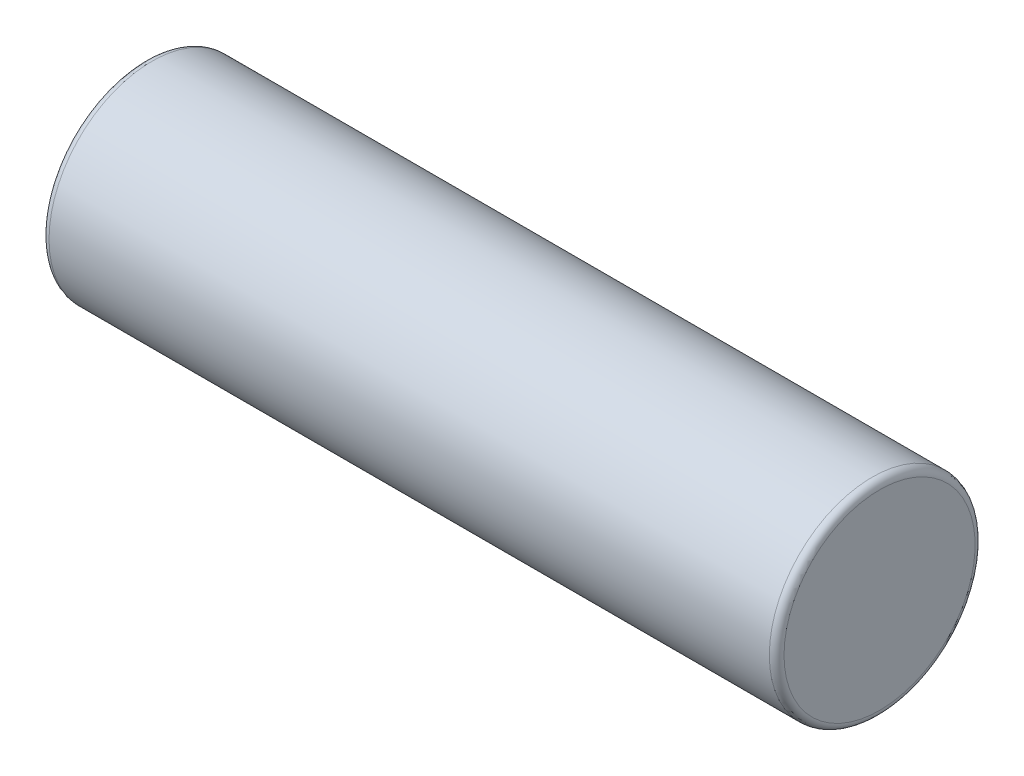
ISO-10303-21;
HEADER;
FILE_DESCRIPTION(('STEP AP214'),'2;1');
FILE_NAME('part.step','',(''),(''),'','','');
FILE_SCHEMA(('AUTOMOTIVE_DESIGN { 1 0 10303 214 1 1 1 1 }'));
ENDSEC;
DATA;
#1=APPLICATION_CONTEXT('core data for automotive mechanical design processes');
#2=APPLICATION_PROTOCOL_DEFINITION('international standard','automotive_design',2000,#1);
#3=PRODUCT_CONTEXT('',#1,'mechanical');
#4=PRODUCT('Part','Part','',(#3));
#5=PRODUCT_RELATED_PRODUCT_CATEGORY('part','',(#4));
#6=PRODUCT_DEFINITION_FORMATION('','',#4);
#7=PRODUCT_DEFINITION_CONTEXT('part definition',#1,'design');
#8=PRODUCT_DEFINITION('design','',#6,#7);
#9=PRODUCT_DEFINITION_SHAPE('','',#8);
#10=(LENGTH_UNIT() NAMED_UNIT(*) SI_UNIT(.MILLI.,.METRE.));
#11=(NAMED_UNIT(*) PLANE_ANGLE_UNIT() SI_UNIT($,.RADIAN.));
#12=(NAMED_UNIT(*) SI_UNIT($,.STERADIAN.) SOLID_ANGLE_UNIT());
#13=UNCERTAINTY_MEASURE_WITH_UNIT(LENGTH_MEASURE(1.E-05),#10,'distance_accuracy_value','');
#14=(GEOMETRIC_REPRESENTATION_CONTEXT(3) GLOBAL_UNCERTAINTY_ASSIGNED_CONTEXT((#13)) GLOBAL_UNIT_ASSIGNED_CONTEXT((#10,
#11,#12)) REPRESENTATION_CONTEXT('',''));
#15=CARTESIAN_POINT('',(0.,0.,0.));
#16=DIRECTION('',(0.,0.,1.));
#17=DIRECTION('',(1.,0.,0.));
#18=AXIS2_PLACEMENT_3D('',#15,#16,#17);
#19=CARTESIAN_POINT('',(0.,0.,0.));
#20=DIRECTION('',(1.,0.,0.));
#21=DIRECTION('',(0.,0.,-1.));
#22=AXIS2_PLACEMENT_3D('',#19,#20,#21);
#23=PLANE('',#22);
#24=CARTESIAN_POINT('',(0.,0.,0.));
#25=DIRECTION('',(1.,0.,0.));
#26=DIRECTION('',(0.,0.,-1.));
#27=AXIS2_PLACEMENT_3D('',#24,#25,#26);
#28=CIRCLE('',#27,6.5);
#29=CARTESIAN_POINT('',(0.,0.,-6.5));
#30=VERTEX_POINT('',#29);
#31=EDGE_CURVE('E10',#30,#30,#28,.F.);
#32=ORIENTED_EDGE('',*,*,#31,.T.);
#33=EDGE_LOOP('',(#32));
#34=FACE_BOUND('',#33,.T.);
#35=ADVANCED_FACE('F33',(#34),#23,.F.);
#36=CARTESIAN_POINT('',(0.,0.,0.));
#37=DIRECTION('',(-1.,0.,0.));
#38=DIRECTION('',(0.,0.,1.));
#39=AXIS2_PLACEMENT_3D('',#36,#37,#38);
#40=CYLINDRICAL_SURFACE('',#39,7.);
#41=CARTESIAN_POINT('',(49.5,0.,0.));
#42=DIRECTION('',(-1.,0.,0.));
#43=DIRECTION('',(0.,0.,1.));
#44=AXIS2_PLACEMENT_3D('',#41,#42,#43);
#45=CIRCLE('',#44,7.);
#46=CARTESIAN_POINT('',(49.5,0.,7.));
#47=VERTEX_POINT('',#46);
#48=EDGE_CURVE('E44',#47,#47,#45,.T.);
#49=ORIENTED_EDGE('',*,*,#48,.T.);
#50=EDGE_LOOP('',(#49));
#51=FACE_BOUND('',#50,.T.);
#52=CARTESIAN_POINT('',(0.5,0.,0.));
#53=DIRECTION('',(1.,0.,0.));
#54=DIRECTION('',(0.,0.,-1.));
#55=AXIS2_PLACEMENT_3D('',#52,#53,#54);
#56=CIRCLE('',#55,7.);
#57=CARTESIAN_POINT('',(0.5,0.,-7.));
#58=VERTEX_POINT('',#57);
#59=EDGE_CURVE('E48',#58,#58,#56,.T.);
#60=ORIENTED_EDGE('',*,*,#59,.T.);
#61=EDGE_LOOP('',(#60));
#62=FACE_BOUND('',#61,.T.);
#63=ADVANCED_FACE('F54',(#51,#62),#40,.T.);
#64=CARTESIAN_POINT('',(50.,7.,0.));
#65=DIRECTION('',(-1.,0.,0.));
#66=DIRECTION('',(0.,0.,1.));
#67=AXIS2_PLACEMENT_3D('',#64,#65,#66);
#68=PLANE('',#67);
#69=CARTESIAN_POINT('',(50.,0.,0.));
#70=DIRECTION('',(-1.,0.,0.));
#71=DIRECTION('',(0.,0.,1.));
#72=AXIS2_PLACEMENT_3D('',#69,#70,#71);
#73=CIRCLE('',#72,6.5);
#74=CARTESIAN_POINT('',(50.,0.,6.5));
#75=VERTEX_POINT('',#74);
#76=EDGE_CURVE('E40',#75,#75,#73,.F.);
#77=ORIENTED_EDGE('',*,*,#76,.T.);
#78=EDGE_LOOP('',(#77));
#79=FACE_BOUND('',#78,.T.);
#80=ADVANCED_FACE('F62',(#79),#68,.F.);
#81=CARTESIAN_POINT('',(49.5,0.,0.));
#82=DIRECTION('',(-1.,0.,0.));
#83=DIRECTION('',(0.,0.,1.));
#84=AXIS2_PLACEMENT_3D('',#81,#82,#83);
#85=TOROIDAL_SURFACE('',#84,6.5,0.5);
#86=ORIENTED_EDGE('',*,*,#76,.F.);
#87=EDGE_LOOP('',(#86));
#88=FACE_BOUND('',#87,.T.);
#89=ORIENTED_EDGE('',*,*,#48,.F.);
#90=EDGE_LOOP('',(#89));
#91=FACE_BOUND('',#90,.T.);
#92=ADVANCED_FACE('F58',(#88,#91),#85,.T.);
#93=CARTESIAN_POINT('',(0.5,0.,0.));
#94=DIRECTION('',(1.,0.,0.));
#95=DIRECTION('',(0.,0.,-1.));
#96=AXIS2_PLACEMENT_3D('',#93,#94,#95);
#97=TOROIDAL_SURFACE('',#96,6.5,0.5);
#98=ORIENTED_EDGE('',*,*,#59,.F.);
#99=EDGE_LOOP('',(#98));
#100=FACE_BOUND('',#99,.T.);
#101=ORIENTED_EDGE('',*,*,#31,.F.);
#102=EDGE_LOOP('',(#101));
#103=FACE_BOUND('',#102,.T.);
#104=ADVANCED_FACE('F35',(#100,#103),#97,.T.);
#105=CLOSED_SHELL('',(#35,#63,#80,#92,#104));
#106=MANIFOLD_SOLID_BREP('B2',#105);
#107=ADVANCED_BREP_SHAPE_REPRESENTATION('',(#18,#106),#14);
#108=SHAPE_DEFINITION_REPRESENTATION(#9,#107);
ENDSEC;
END-ISO-10303-21;
